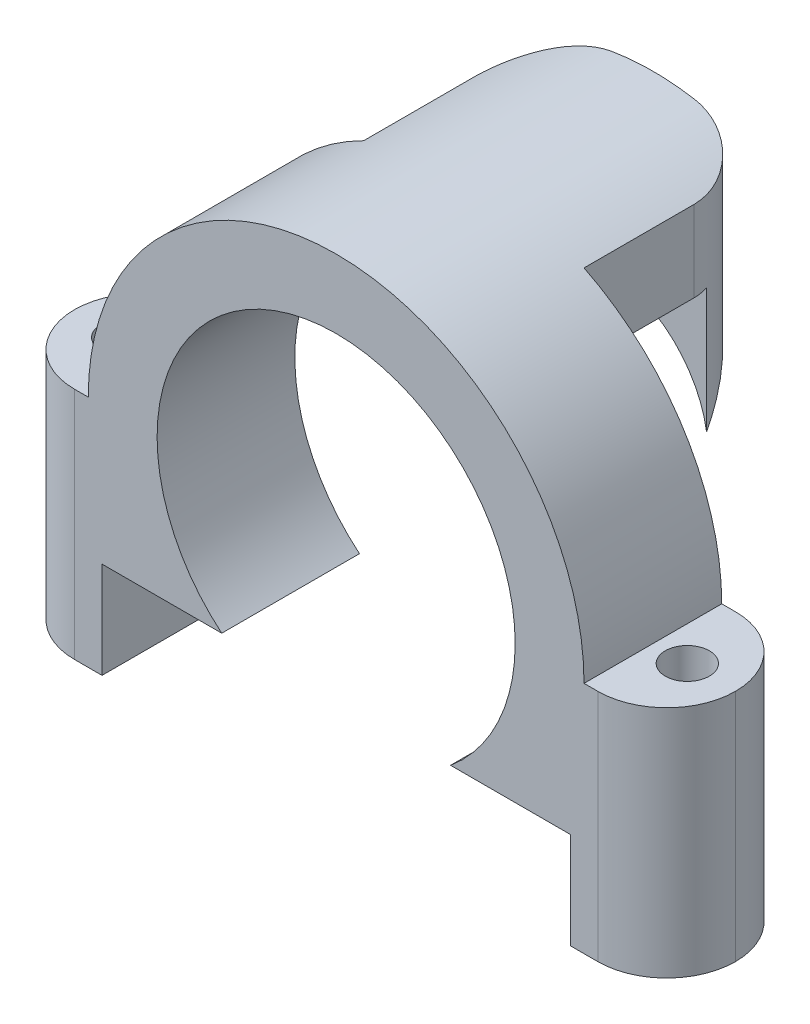
ISO-10303-21;
HEADER;
FILE_DESCRIPTION(('STEP AP214'),'2;1');
FILE_NAME('part.step','',(''),(''),'','','');
FILE_SCHEMA(('AUTOMOTIVE_DESIGN { 1 0 10303 214 1 1 1 1 }'));
ENDSEC;
DATA;
#1=APPLICATION_CONTEXT('core data for automotive mechanical design processes');
#2=APPLICATION_PROTOCOL_DEFINITION('international standard','automotive_design',2000,#1);
#3=PRODUCT_CONTEXT('',#1,'mechanical');
#4=PRODUCT('Part','Part','',(#3));
#5=PRODUCT_RELATED_PRODUCT_CATEGORY('part','',(#4));
#6=PRODUCT_DEFINITION_FORMATION('','',#4);
#7=PRODUCT_DEFINITION_CONTEXT('part definition',#1,'design');
#8=PRODUCT_DEFINITION('design','',#6,#7);
#9=PRODUCT_DEFINITION_SHAPE('','',#8);
#10=(LENGTH_UNIT() NAMED_UNIT(*) SI_UNIT(.MILLI.,.METRE.));
#11=(NAMED_UNIT(*) PLANE_ANGLE_UNIT() SI_UNIT($,.RADIAN.));
#12=(NAMED_UNIT(*) SI_UNIT($,.STERADIAN.) SOLID_ANGLE_UNIT());
#13=UNCERTAINTY_MEASURE_WITH_UNIT(LENGTH_MEASURE(1.E-05),#10,'distance_accuracy_value','');
#14=(GEOMETRIC_REPRESENTATION_CONTEXT(3) GLOBAL_UNCERTAINTY_ASSIGNED_CONTEXT((#13)) GLOBAL_UNIT_ASSIGNED_CONTEXT((#10,
#11,#12)) REPRESENTATION_CONTEXT('',''));
#15=CARTESIAN_POINT('',(0.,0.,0.));
#16=DIRECTION('',(0.,0.,1.));
#17=DIRECTION('',(1.,0.,0.));
#18=AXIS2_PLACEMENT_3D('',#15,#16,#17);
#19=CARTESIAN_POINT('',(0.,6.53295697895827E-07,0.));
#20=DIRECTION('',(0.,0.,1.));
#21=DIRECTION('',(1.,0.,0.));
#22=AXIS2_PLACEMENT_3D('',#19,#20,#21);
#23=PLANE('',#22);
#24=DIRECTION('',(0.,1.,0.));
#25=VECTOR('',#24,1.);
#26=CARTESIAN_POINT('',(-8.,10.2469507659596,0.));
#27=LINE('',#26,#25);
#28=CARTESIAN_POINT('',(-8.,10.2469507659596,0.));
#29=VERTEX_POINT('',#28);
#30=CARTESIAN_POINT('',(-8.,16.1245161498928,0.));
#31=VERTEX_POINT('',#30);
#32=EDGE_CURVE('E192',#29,#31,#27,.T.);
#33=ORIENTED_EDGE('',*,*,#32,.F.);
#34=CARTESIAN_POINT('',(0.,0.,0.));
#35=DIRECTION('',(0.,0.,-1.));
#36=DIRECTION('',(-1.,0.,0.));
#37=AXIS2_PLACEMENT_3D('',#34,#35,#36);
#38=CIRCLE('',#37,13.);
#39=CARTESIAN_POINT('',(-8.30662386291808,-10.,0.));
#40=VERTEX_POINT('',#39);
#41=EDGE_CURVE('E204',#40,#29,#38,.T.);
#42=ORIENTED_EDGE('',*,*,#41,.F.);
#43=DIRECTION('',(1.,0.,0.));
#44=VECTOR('',#43,1.);
#45=CARTESIAN_POINT('',(-24.,-10.,0.));
#46=LINE('',#45,#44);
#47=CARTESIAN_POINT('',(-17.,-10.,0.));
#48=VERTEX_POINT('',#47);
#49=EDGE_CURVE('E241',#48,#40,#46,.T.);
#50=ORIENTED_EDGE('',*,*,#49,.F.);
#51=DIRECTION('',(0.,1.,0.));
#52=VECTOR('',#51,1.);
#53=CARTESIAN_POINT('',(-17.,-17.,0.));
#54=LINE('',#53,#52);
#55=CARTESIAN_POINT('',(-17.,-17.,0.));
#56=VERTEX_POINT('',#55);
#57=EDGE_CURVE('E325',#56,#48,#54,.T.);
#58=ORIENTED_EDGE('',*,*,#57,.F.);
#59=DIRECTION('',(1.,0.,0.));
#60=VECTOR('',#59,1.);
#61=CARTESIAN_POINT('',(0.,-17.,0.));
#62=LINE('',#61,#60);
#63=CARTESIAN_POINT('',(-19.,-17.,0.));
#64=VERTEX_POINT('',#63);
#65=EDGE_CURVE('E323',#64,#56,#62,.T.);
#66=ORIENTED_EDGE('',*,*,#65,.F.);
#67=DIRECTION('',(0.,-1.,0.));
#68=VECTOR('',#67,1.);
#69=CARTESIAN_POINT('',(-19.,6.53295691303878E-07,0.));
#70=LINE('',#69,#68);
#71=CARTESIAN_POINT('',(-19.,0.,0.));
#72=VERTEX_POINT('',#71);
#73=EDGE_CURVE('E267',#64,#72,#70,.F.);
#74=ORIENTED_EDGE('',*,*,#73,.T.);
#75=DIRECTION('',(-1.,0.,0.));
#76=VECTOR('',#75,1.);
#77=CARTESIAN_POINT('',(-18.,0.,0.));
#78=LINE('',#77,#76);
#79=CARTESIAN_POINT('',(-18.,0.,0.));
#80=VERTEX_POINT('',#79);
#81=EDGE_CURVE('E237',#80,#72,#78,.T.);
#82=ORIENTED_EDGE('',*,*,#81,.F.);
#83=CARTESIAN_POINT('',(0.,6.53295697895827E-07,0.));
#84=DIRECTION('',(0.,0.,1.));
#85=DIRECTION('',(1.,0.,0.));
#86=AXIS2_PLACEMENT_3D('',#83,#84,#85);
#87=CIRCLE('',#86,18.);
#88=EDGE_CURVE('E206',#31,#80,#87,.T.);
#89=ORIENTED_EDGE('',*,*,#88,.F.);
#90=EDGE_LOOP('',(#33,#42,#50,#58,#66,#74,#82,#89));
#91=FACE_BOUND('',#90,.T.);
#92=ADVANCED_FACE('F36',(#91),#23,.F.);
#93=DIRECTION('',(0.,-1.,0.));
#94=VECTOR('',#93,1.);
#95=CARTESIAN_POINT('',(8.,10.2469507659596,0.));
#96=LINE('',#95,#94);
#97=CARTESIAN_POINT('',(8.00000000000001,16.1245161498928,0.));
#98=VERTEX_POINT('',#97);
#99=CARTESIAN_POINT('',(8.,10.2469507659596,0.));
#100=VERTEX_POINT('',#99);
#101=EDGE_CURVE('E207',#98,#100,#96,.T.);
#102=ORIENTED_EDGE('',*,*,#101,.F.);
#103=CARTESIAN_POINT('',(18.,0.,0.));
#104=VERTEX_POINT('',#103);
#105=EDGE_CURVE('E216',#104,#98,#87,.T.);
#106=ORIENTED_EDGE('',*,*,#105,.F.);
#107=DIRECTION('',(-1.,0.,0.));
#108=VECTOR('',#107,1.);
#109=CARTESIAN_POINT('',(18.,0.,0.));
#110=LINE('',#109,#108);
#111=CARTESIAN_POINT('',(19.,0.,0.));
#112=VERTEX_POINT('',#111);
#113=EDGE_CURVE('E226',#112,#104,#110,.T.);
#114=ORIENTED_EDGE('',*,*,#113,.F.);
#115=DIRECTION('',(0.,1.,0.));
#116=VECTOR('',#115,1.);
#117=CARTESIAN_POINT('',(19.,6.53295704487776E-07,0.));
#118=LINE('',#117,#116);
#119=CARTESIAN_POINT('',(19.,-17.,0.));
#120=VERTEX_POINT('',#119);
#121=EDGE_CURVE('E269',#112,#120,#118,.F.);
#122=ORIENTED_EDGE('',*,*,#121,.T.);
#123=DIRECTION('',(1.,0.,0.));
#124=VECTOR('',#123,1.);
#125=CARTESIAN_POINT('',(0.,-17.,0.));
#126=LINE('',#125,#124);
#127=CARTESIAN_POINT('',(17.,-17.,0.));
#128=VERTEX_POINT('',#127);
#129=EDGE_CURVE('E337',#128,#120,#126,.T.);
#130=ORIENTED_EDGE('',*,*,#129,.F.);
#131=DIRECTION('',(0.,1.,0.));
#132=VECTOR('',#131,1.);
#133=CARTESIAN_POINT('',(17.,-17.,0.));
#134=LINE('',#133,#132);
#135=CARTESIAN_POINT('',(17.,-10.,0.));
#136=VERTEX_POINT('',#135);
#137=EDGE_CURVE('E348',#128,#136,#134,.T.);
#138=ORIENTED_EDGE('',*,*,#137,.T.);
#139=CARTESIAN_POINT('',(8.30662386291808,-10.,0.));
#140=VERTEX_POINT('',#139);
#141=EDGE_CURVE('E240',#140,#136,#46,.T.);
#142=ORIENTED_EDGE('',*,*,#141,.F.);
#143=EDGE_CURVE('E214',#100,#140,#38,.T.);
#144=ORIENTED_EDGE('',*,*,#143,.F.);
#145=EDGE_LOOP('',(#102,#106,#114,#122,#130,#138,#142,#144));
#146=FACE_BOUND('',#145,.T.);
#147=ADVANCED_FACE('F384',(#146),#23,.F.);
#148=CARTESIAN_POINT('',(-24.,-10.,10.));
#149=DIRECTION('',(0.,1.,0.));
#150=DIRECTION('',(0.,0.,1.));
#151=AXIS2_PLACEMENT_3D('',#148,#149,#150);
#152=PLANE('',#151);
#153=DIRECTION('',(1.,0.,0.));
#154=VECTOR('',#153,1.);
#155=CARTESIAN_POINT('',(-24.,-10.,10.));
#156=LINE('',#155,#154);
#157=CARTESIAN_POINT('',(8.30662386291808,-10.,10.));
#158=VERTEX_POINT('',#157);
#159=CARTESIAN_POINT('',(17.,-10.,10.));
#160=VERTEX_POINT('',#159);
#161=EDGE_CURVE('E229',#158,#160,#156,.T.);
#162=ORIENTED_EDGE('',*,*,#161,.F.);
#163=DIRECTION('',(0.,0.,-1.));
#164=VECTOR('',#163,1.);
#165=CARTESIAN_POINT('',(8.30662386291808,-10.,6.));
#166=LINE('',#165,#164);
#167=EDGE_CURVE('E250',#158,#140,#166,.T.);
#168=ORIENTED_EDGE('',*,*,#167,.T.);
#169=ORIENTED_EDGE('',*,*,#141,.T.);
#170=DIRECTION('',(0.,0.,1.));
#171=VECTOR('',#170,1.);
#172=CARTESIAN_POINT('',(17.,-10.,-33.2782801676287));
#173=LINE('',#172,#171);
#174=EDGE_CURVE('E333',#136,#160,#173,.T.);
#175=ORIENTED_EDGE('',*,*,#174,.T.);
#176=EDGE_LOOP('',(#162,#168,#169,#175));
#177=FACE_BOUND('',#176,.T.);
#178=ADVANCED_FACE('F419',(#177),#152,.F.);
#179=CARTESIAN_POINT('',(0.,6.53295697895827E-07,10.));
#180=DIRECTION('',(0.,0.,1.));
#181=DIRECTION('',(1.,0.,0.));
#182=AXIS2_PLACEMENT_3D('',#179,#180,#181);
#183=PLANE('',#182);
#184=CARTESIAN_POINT('',(0.,0.,10.));
#185=DIRECTION('',(0.,0.,1.));
#186=DIRECTION('',(1.,0.,0.));
#187=AXIS2_PLACEMENT_3D('',#184,#185,#186);
#188=CIRCLE('',#187,13.);
#189=CARTESIAN_POINT('',(-8.30662386291808,-10.,10.));
#190=VERTEX_POINT('',#189);
#191=EDGE_CURVE('E199',#190,#158,#188,.F.);
#192=ORIENTED_EDGE('',*,*,#191,.T.);
#193=ORIENTED_EDGE('',*,*,#161,.T.);
#194=DIRECTION('',(0.,1.,0.));
#195=VECTOR('',#194,1.);
#196=CARTESIAN_POINT('',(17.,-17.,10.));
#197=LINE('',#196,#195);
#198=CARTESIAN_POINT('',(17.,-17.,10.));
#199=VERTEX_POINT('',#198);
#200=EDGE_CURVE('E343',#199,#160,#197,.T.);
#201=ORIENTED_EDGE('',*,*,#200,.F.);
#202=DIRECTION('',(1.,0.,0.));
#203=VECTOR('',#202,1.);
#204=CARTESIAN_POINT('',(0.,-17.,10.));
#205=LINE('',#204,#203);
#206=CARTESIAN_POINT('',(19.,-17.,10.));
#207=VERTEX_POINT('',#206);
#208=EDGE_CURVE('E340',#199,#207,#205,.T.);
#209=ORIENTED_EDGE('',*,*,#208,.T.);
#210=DIRECTION('',(0.,1.,0.));
#211=VECTOR('',#210,1.);
#212=CARTESIAN_POINT('',(19.,0.,10.));
#213=LINE('',#212,#211);
#214=CARTESIAN_POINT('',(19.,0.,10.));
#215=VERTEX_POINT('',#214);
#216=EDGE_CURVE('E256',#207,#215,#213,.T.);
#217=ORIENTED_EDGE('',*,*,#216,.T.);
#218=DIRECTION('',(-1.,0.,0.));
#219=VECTOR('',#218,1.);
#220=CARTESIAN_POINT('',(18.,0.,10.));
#221=LINE('',#220,#219);
#222=CARTESIAN_POINT('',(18.,0.,10.));
#223=VERTEX_POINT('',#222);
#224=EDGE_CURVE('E233',#215,#223,#221,.T.);
#225=ORIENTED_EDGE('',*,*,#224,.T.);
#226=CARTESIAN_POINT('',(0.,6.53295697895827E-07,10.));
#227=DIRECTION('',(0.,0.,1.));
#228=DIRECTION('',(1.,0.,0.));
#229=AXIS2_PLACEMENT_3D('',#226,#227,#228);
#230=CIRCLE('',#229,18.);
#231=CARTESIAN_POINT('',(-18.,0.,10.));
#232=VERTEX_POINT('',#231);
#233=EDGE_CURVE('E222',#223,#232,#230,.T.);
#234=ORIENTED_EDGE('',*,*,#233,.T.);
#235=DIRECTION('',(-1.,0.,0.));
#236=VECTOR('',#235,1.);
#237=CARTESIAN_POINT('',(-18.,0.,10.));
#238=LINE('',#237,#236);
#239=CARTESIAN_POINT('',(-19.,0.,10.));
#240=VERTEX_POINT('',#239);
#241=EDGE_CURVE('E225',#232,#240,#238,.T.);
#242=ORIENTED_EDGE('',*,*,#241,.T.);
#243=DIRECTION('',(0.,-1.,0.));
#244=VECTOR('',#243,1.);
#245=CARTESIAN_POINT('',(-19.,-17.,10.));
#246=LINE('',#245,#244);
#247=CARTESIAN_POINT('',(-19.,-17.,10.));
#248=VERTEX_POINT('',#247);
#249=EDGE_CURVE('E253',#240,#248,#246,.T.);
#250=ORIENTED_EDGE('',*,*,#249,.T.);
#251=DIRECTION('',(1.,0.,0.));
#252=VECTOR('',#251,1.);
#253=CARTESIAN_POINT('',(0.,-17.,10.));
#254=LINE('',#253,#252);
#255=CARTESIAN_POINT('',(-17.,-17.,10.));
#256=VERTEX_POINT('',#255);
#257=EDGE_CURVE('E321',#248,#256,#254,.T.);
#258=ORIENTED_EDGE('',*,*,#257,.T.);
#259=DIRECTION('',(0.,1.,0.));
#260=VECTOR('',#259,1.);
#261=CARTESIAN_POINT('',(-17.,-17.,10.));
#262=LINE('',#261,#260);
#263=CARTESIAN_POINT('',(-17.,-10.,10.));
#264=VERTEX_POINT('',#263);
#265=EDGE_CURVE('E330',#256,#264,#262,.T.);
#266=ORIENTED_EDGE('',*,*,#265,.T.);
#267=EDGE_CURVE('E230',#264,#190,#156,.T.);
#268=ORIENTED_EDGE('',*,*,#267,.T.);
#269=EDGE_LOOP('',(#192,#193,#201,#209,#217,#225,#234,#242,#250,#258,#266,#268));
#270=FACE_BOUND('',#269,.T.);
#271=ADVANCED_FACE('F368',(#270),#183,.T.);
#272=CARTESIAN_POINT('',(0.,6.53295697895827E-07,10.));
#273=DIRECTION('',(0.,0.,-1.));
#274=DIRECTION('',(-1.,0.,0.));
#275=AXIS2_PLACEMENT_3D('',#272,#273,#274);
#276=CYLINDRICAL_SURFACE('',#275,18.);
#277=CARTESIAN_POINT('',(0.,0.,-13.));
#278=DIRECTION('',(0.,0.,-1.));
#279=DIRECTION('',(1.,0.,0.));
#280=AXIS2_PLACEMENT_3D('',#277,#278,#279);
#281=CIRCLE('',#280,18.0000005852265);
#282=CARTESIAN_POINT('',(-3.,17.7482399428268,-13.));
#283=VERTEX_POINT('',#282);
#284=CARTESIAN_POINT('',(3.00000000000001,17.7482399428268,-13.));
#285=VERTEX_POINT('',#284);
#286=EDGE_CURVE('E468',#283,#285,#281,.T.);
#287=ORIENTED_EDGE('',*,*,#286,.F.);
#288=CARTESIAN_POINT('',(-3.,17.7482399428268,-13.));
#289=CARTESIAN_POINT('',(-3.14316237557069,17.724058120837,-13.0000149783251));
#290=CARTESIAN_POINT('',(-3.28600356103933,17.6981153872268,-12.9938519695718));
#291=CARTESIAN_POINT('',(-3.56997368074114,17.6430174261176,-12.9694458275642));
#292=CARTESIAN_POINT('',(-3.71110321544793,17.61386336365,-12.9512070632941));
#293=CARTESIAN_POINT('',(-3.99029951109032,17.55271861298,-12.9029914777806));
#294=CARTESIAN_POINT('',(-4.12837364753594,17.5207359724349,-12.8730471786324));
#295=CARTESIAN_POINT('',(-4.40091298104137,17.4542745495001,-12.8018021304778));
#296=CARTESIAN_POINT('',(-4.53537791733336,17.4197955874108,-12.7605005633103));
#297=CARTESIAN_POINT('',(-4.93178891492285,17.3133468712652,-12.6202345666979));
#298=CARTESIAN_POINT('',(-5.18728326956141,17.2382469787397,-12.5048152721025));
#299=CARTESIAN_POINT('',(-5.67462576103925,17.084034738557,-12.2337109656115));
#300=CARTESIAN_POINT('',(-5.90645594297512,17.0049194113841,-12.0779956916773));
#301=CARTESIAN_POINT('',(-6.34979222974087,16.8445200064896,-11.7232527613008));
#302=CARTESIAN_POINT('',(-6.56014935663975,16.7632720706178,-11.5227697451431));
#303=CARTESIAN_POINT('',(-6.94425247226011,16.6078414630621,-11.0866139740293));
#304=CARTESIAN_POINT('',(-7.1179926098392,16.5336599215755,-10.8509356053632));
#305=CARTESIAN_POINT('',(-7.34606482617979,16.4329613386774,-10.4764794351531));
#306=CARTESIAN_POINT('',(-7.41648107756362,16.4012475158769,-10.3486406680782));
#307=CARTESIAN_POINT('',(-7.54617483109551,16.3419810013723,-10.086536791224));
#308=CARTESIAN_POINT('',(-7.60545777541184,16.3144262779226,-9.95227486169067));
#309=CARTESIAN_POINT('',(-7.71215296047878,16.2642613331573,-9.67844548103771));
#310=CARTESIAN_POINT('',(-7.75958197480813,16.2416441309414,-9.53888585232932));
#311=CARTESIAN_POINT('',(-7.84206635531543,16.2019785732816,-9.25545652932541));
#312=CARTESIAN_POINT('',(-7.87712733576723,16.1849276913571,-9.11158882287285));
#313=CARTESIAN_POINT('',(-7.93698981063472,16.1556628241357,-8.80759803937893));
#314=CARTESIAN_POINT('',(-7.96058509105631,16.1440217307767,-8.64717664839533));
#315=CARTESIAN_POINT('',(-7.98421465259047,16.1323402918031,-8.40519991206023));
#316=CARTESIAN_POINT('',(-7.99013061637205,16.1294098418307,-8.32430893661166));
#317=CARTESIAN_POINT('',(-7.99802371391825,16.125496845392,-8.16228439890615));
#318=CARTESIAN_POINT('',(-8.0000006648757,16.1245143893309,-8.08115082556539));
#319=CARTESIAN_POINT('',(-8.,16.1245161498928,-8.));
#320=B_SPLINE_CURVE_WITH_KNOTS('',3,(#288,#289,#290,#291,#292,#293,#294,#295,#296,#297,#298,
#299,#300,#301,#302,#303,#304,#305,#306,#307,#308,#309,#310,#311,#312,#313,#314,#315,#316,#317,
#318,#319),.UNSPECIFIED.,.F.,.F.,(4,2,2,2,2,2,2,2,2,2,2,2,2,2,2,4),(0.,0.435392965080862,
0.870628491874958,1.30466327880671,1.73872934116996,2.60522270635657,3.47236870091879,
4.37341744770306,5.27461006688168,5.7221734143791,6.16951741184309,6.61622477720137,
7.06272910507154,7.54938826982394,7.7927653307537,8.03615368640039),.UNSPECIFIED.);
#321=CARTESIAN_POINT('',(-8.,16.1245161498928,-8.));
#322=VERTEX_POINT('',#321);
#323=EDGE_CURVE('E293',#283,#322,#320,.T.);
#324=ORIENTED_EDGE('',*,*,#323,.T.);
#325=DIRECTION('',(0.,0.,1.));
#326=VECTOR('',#325,1.);
#327=CARTESIAN_POINT('',(-8.,16.1245161498928,-9.));
#328=LINE('',#327,#326);
#329=EDGE_CURVE('E200',#322,#31,#328,.T.);
#330=ORIENTED_EDGE('',*,*,#329,.T.);
#331=ORIENTED_EDGE('',*,*,#88,.T.);
#332=DIRECTION('',(0.,0.,-1.));
#333=VECTOR('',#332,1.);
#334=CARTESIAN_POINT('',(-18.,0.,10.));
#335=LINE('',#334,#333);
#336=EDGE_CURVE('E246',#232,#80,#335,.T.);
#337=ORIENTED_EDGE('',*,*,#336,.F.);
#338=ORIENTED_EDGE('',*,*,#233,.F.);
#339=DIRECTION('',(0.,0.,-1.));
#340=VECTOR('',#339,1.);
#341=CARTESIAN_POINT('',(18.,0.,10.));
#342=LINE('',#341,#340);
#343=EDGE_CURVE('E234',#223,#104,#342,.T.);
#344=ORIENTED_EDGE('',*,*,#343,.T.);
#345=ORIENTED_EDGE('',*,*,#105,.T.);
#346=DIRECTION('',(0.,0.,1.));
#347=VECTOR('',#346,1.);
#348=CARTESIAN_POINT('',(8.00000000000001,16.1245161498928,-9.));
#349=LINE('',#348,#347);
#350=CARTESIAN_POINT('',(8.00000000000001,16.1245161498928,-8.));
#351=VERTEX_POINT('',#350);
#352=EDGE_CURVE('E313',#351,#98,#349,.T.);
#353=ORIENTED_EDGE('',*,*,#352,.F.);
#354=CARTESIAN_POINT('',(8.00000000000001,16.1245161498928,-8.));
#355=CARTESIAN_POINT('',(8.0000222337078,16.1244919780298,-8.13202101531183));
#356=CARTESIAN_POINT('',(7.99477214977667,16.1271095463448,-8.26403022610739));
#357=CARTESIAN_POINT('',(7.97389442193796,16.1374495282992,-8.52697346061946));
#358=CARTESIAN_POINT('',(7.95827088365557,16.1451699223272,-8.65790788896834));
#359=CARTESIAN_POINT('',(7.91690339031869,16.1654928146154,-8.91718996165917));
#360=CARTESIAN_POINT('',(7.8912038234646,16.1780738964567,-9.04554639060287));
#361=CARTESIAN_POINT('',(7.82998088711945,16.2077939465973,-9.29935612822058));
#362=CARTESIAN_POINT('',(7.79445690933398,16.2249331971205,-9.42480925661061));
#363=CARTESIAN_POINT('',(7.7140087853257,16.2633350964308,-9.67181474021454));
#364=CARTESIAN_POINT('',(7.66909802585852,16.2845918699737,-9.79337236920734));
#365=CARTESIAN_POINT('',(7.57027403770922,16.3307668485678,-10.0320692899112));
#366=CARTESIAN_POINT('',(7.51635741596478,16.3556864331989,-10.1492068958592));
#367=CARTESIAN_POINT('',(7.34170226254043,16.4352002829623,-10.4931226610116));
#368=CARTESIAN_POINT('',(7.20805665790651,16.4945505215019,-10.7124091915609));
#369=CARTESIAN_POINT('',(6.90179698867781,16.6251142536656,-11.1382744838696));
#370=CARTESIAN_POINT('',(6.72738560316027,16.6968133374398,-11.3433999412831));
#371=CARTESIAN_POINT('',(6.34886292971728,16.8443824066329,-11.722483351293));
#372=CARTESIAN_POINT('',(6.14473892137532,16.9202541697384,-11.8964278833378));
#373=CARTESIAN_POINT('',(5.69396159506863,17.0774748407382,-12.2220710547069));
#374=CARTESIAN_POINT('',(5.44521858286892,17.1587804809164,-12.3709080507776));
#375=CARTESIAN_POINT('',(4.92439676816108,17.3154297028822,-12.6238938822678));
#376=CARTESIAN_POINT('',(4.65233619631925,17.3907778554535,-12.7280772541715));
#377=CARTESIAN_POINT('',(4.15092246886841,17.5163331060582,-12.8711682095608));
#378=CARTESIAN_POINT('',(3.9246490550475,17.5684923627257,-12.9192042946261));
#379=CARTESIAN_POINT('',(3.58067878885885,17.6406505282204,-12.9675200495833));
#380=CARTESIAN_POINT('',(3.46519821265621,17.663700633,-12.9796690434036));
#381=CARTESIAN_POINT('',(3.23322338580852,17.7076329656372,-12.9959115047899));
#382=CARTESIAN_POINT('',(3.11672881034459,17.7285144688707,-13.0000022879087));
#383=CARTESIAN_POINT('',(3.00000001435777,17.7482400001676,-13.));
#384=B_SPLINE_CURVE_WITH_KNOTS('',3,(#354,#355,#356,#357,#358,#359,#360,#361,#362,#363,#364,
#365,#366,#367,#368,#369,#370,#371,#372,#373,#374,#375,#376,#377,#378,#379,#380,#381,#382,#383),
.UNSPECIFIED.,.F.,.F.,(4,2,2,2,2,2,2,2,2,2,2,2,2,2,4),(0.,0.395914229182373,0.791671856020214,
1.18570528433774,1.57976311534142,1.97326275765572,2.3669109912883,3.15419032648427,
3.98668820936115,4.81954355097226,5.7185060673813,6.61677203838417,7.3257708214226,
7.68065492093143,8.0356572236762),.UNSPECIFIED.);
#385=EDGE_CURVE('E454',#351,#285,#384,.T.);
#386=ORIENTED_EDGE('',*,*,#385,.T.);
#387=EDGE_LOOP('',(#287,#324,#330,#331,#337,#338,#344,#345,#353,#386));
#388=FACE_BOUND('',#387,.T.);
#389=ADVANCED_FACE('F390',(#388),#276,.T.);
#390=CARTESIAN_POINT('',(-18.,0.,10.));
#391=DIRECTION('',(0.,-1.,0.));
#392=DIRECTION('',(1.,0.,0.));
#393=AXIS2_PLACEMENT_3D('',#390,#391,#392);
#394=PLANE('',#393);
#395=CARTESIAN_POINT('',(-20.5,0.,5.));
#396=DIRECTION('',(0.,1.,0.));
#397=DIRECTION('',(0.,0.,1.));
#398=AXIS2_PLACEMENT_3D('',#395,#396,#397);
#399=CIRCLE('',#398,1.6);
#400=CARTESIAN_POINT('',(-20.5,0.,6.6));
#401=VERTEX_POINT('',#400);
#402=EDGE_CURVE('E349',#401,#401,#399,.T.);
#403=ORIENTED_EDGE('',*,*,#402,.F.);
#404=EDGE_LOOP('',(#403));
#405=FACE_BOUND('',#404,.T.);
#406=CARTESIAN_POINT('',(-19.,0.,5.));
#407=DIRECTION('',(0.,-1.,0.));
#408=DIRECTION('',(1.,0.,0.));
#409=AXIS2_PLACEMENT_3D('',#406,#407,#408);
#410=CIRCLE('',#409,5.);
#411=CARTESIAN_POINT('',(-24.,0.,5.));
#412=VERTEX_POINT('',#411);
#413=EDGE_CURVE('E275',#72,#412,#410,.F.);
#414=ORIENTED_EDGE('',*,*,#413,.T.);
#415=CARTESIAN_POINT('',(-19.,0.,5.));
#416=DIRECTION('',(0.,-1.,0.));
#417=DIRECTION('',(1.,0.,0.));
#418=AXIS2_PLACEMENT_3D('',#415,#416,#417);
#419=CIRCLE('',#418,5.);
#420=EDGE_CURVE('E277',#412,#240,#419,.F.);
#421=ORIENTED_EDGE('',*,*,#420,.T.);
#422=ORIENTED_EDGE('',*,*,#241,.F.);
#423=ORIENTED_EDGE('',*,*,#336,.T.);
#424=ORIENTED_EDGE('',*,*,#81,.T.);
#425=EDGE_LOOP('',(#414,#421,#422,#423,#424));
#426=FACE_BOUND('',#425,.T.);
#427=ADVANCED_FACE('F393',(#405,#426),#394,.F.);
#428=DIRECTION('',(0.,0.,-1.));
#429=VECTOR('',#428,1.);
#430=CARTESIAN_POINT('',(-8.30662386291808,-10.,6.));
#431=LINE('',#430,#429);
#432=EDGE_CURVE('E213',#40,#190,#431,.F.);
#433=ORIENTED_EDGE('',*,*,#432,.T.);
#434=ORIENTED_EDGE('',*,*,#267,.F.);
#435=DIRECTION('',(0.,0.,-1.));
#436=VECTOR('',#435,1.);
#437=CARTESIAN_POINT('',(-17.,-10.,-33.2782801676287));
#438=LINE('',#437,#436);
#439=EDGE_CURVE('E283',#264,#48,#438,.T.);
#440=ORIENTED_EDGE('',*,*,#439,.T.);
#441=ORIENTED_EDGE('',*,*,#49,.T.);
#442=EDGE_LOOP('',(#433,#434,#440,#441));
#443=FACE_BOUND('',#442,.T.);
#444=ADVANCED_FACE('F361',(#443),#152,.F.);
#445=CARTESIAN_POINT('',(18.,0.,10.));
#446=DIRECTION('',(0.,-1.,0.));
#447=DIRECTION('',(0.,0.,-1.));
#448=AXIS2_PLACEMENT_3D('',#445,#446,#447);
#449=PLANE('',#448);
#450=CARTESIAN_POINT('',(20.5,0.,5.));
#451=DIRECTION('',(0.,1.,0.));
#452=DIRECTION('',(0.,0.,1.));
#453=AXIS2_PLACEMENT_3D('',#450,#451,#452);
#454=CIRCLE('',#453,1.6);
#455=CARTESIAN_POINT('',(20.5,0.,6.6));
#456=VERTEX_POINT('',#455);
#457=EDGE_CURVE('E218',#456,#456,#454,.T.);
#458=ORIENTED_EDGE('',*,*,#457,.F.);
#459=EDGE_LOOP('',(#458));
#460=FACE_BOUND('',#459,.T.);
#461=ORIENTED_EDGE('',*,*,#224,.F.);
#462=CARTESIAN_POINT('',(19.,0.,5.));
#463=DIRECTION('',(0.,-1.,0.));
#464=DIRECTION('',(0.,0.,-1.));
#465=AXIS2_PLACEMENT_3D('',#462,#463,#464);
#466=CIRCLE('',#465,5.);
#467=CARTESIAN_POINT('',(24.,0.,5.));
#468=VERTEX_POINT('',#467);
#469=EDGE_CURVE('E261',#215,#468,#466,.F.);
#470=ORIENTED_EDGE('',*,*,#469,.T.);
#471=CARTESIAN_POINT('',(19.,0.,5.));
#472=DIRECTION('',(0.,-1.,0.));
#473=DIRECTION('',(0.,0.,-1.));
#474=AXIS2_PLACEMENT_3D('',#471,#472,#473);
#475=CIRCLE('',#474,5.);
#476=EDGE_CURVE('E259',#468,#112,#475,.F.);
#477=ORIENTED_EDGE('',*,*,#476,.T.);
#478=ORIENTED_EDGE('',*,*,#113,.T.);
#479=ORIENTED_EDGE('',*,*,#343,.F.);
#480=EDGE_LOOP('',(#461,#470,#477,#478,#479));
#481=FACE_BOUND('',#480,.T.);
#482=ADVANCED_FACE('F358',(#460,#481),#449,.F.);
#483=CARTESIAN_POINT('',(0.,0.,6.));
#484=DIRECTION('',(0.,0.,-1.));
#485=DIRECTION('',(-1.,0.,0.));
#486=AXIS2_PLACEMENT_3D('',#483,#484,#485);
#487=CYLINDRICAL_SURFACE('',#486,13.);
#488=DIRECTION('',(0.,0.,1.));
#489=VECTOR('',#488,1.);
#490=CARTESIAN_POINT('',(-8.,10.2469507659596,-9.));
#491=LINE('',#490,#489);
#492=CARTESIAN_POINT('',(-8.,10.2469507659596,-8.));
#493=VERTEX_POINT('',#492);
#494=EDGE_CURVE('E188',#493,#29,#491,.T.);
#495=ORIENTED_EDGE('',*,*,#494,.F.);
#496=CARTESIAN_POINT('',(-8.,10.2469507659596,-8.));
#497=CARTESIAN_POINT('',(-8.00000615855153,10.2469417226686,-8.08440299544958));
#498=CARTESIAN_POINT('',(-7.99786291707773,10.2486192354111,-8.16880281481918));
#499=CARTESIAN_POINT('',(-7.98934095005651,10.2552660647361,-8.33692354602076));
#500=CARTESIAN_POINT('',(-7.98297901256,10.2602223335179,-8.42064582275639));
#501=CARTESIAN_POINT('',(-7.96608246310548,10.2733462323427,-8.58740960895958));
#502=CARTESIAN_POINT('',(-7.95554797161204,10.281513769674,-8.67045113801016));
#503=CARTESIAN_POINT('',(-7.93034932625937,10.3009609832765,-8.83588044049619));
#504=CARTESIAN_POINT('',(-7.9156689371632,10.3122528909149,-8.91826430759948));
#505=CARTESIAN_POINT('',(-7.89897948556635,10.3250241203884,-9.));
#506=B_SPLINE_CURVE_WITH_KNOTS('',3,(#496,#497,#498,#499,#500,#501,#502,#503,#504,#505),
.UNSPECIFIED.,.F.,.F.,(4,2,2,2,4),(0.,0.253160212101457,0.505318985846606,0.757470480121291,
1.01062342156523),.UNSPECIFIED.);
#507=CARTESIAN_POINT('',(-7.89897948556635,10.3250241203884,-9.));
#508=VERTEX_POINT('',#507);
#509=EDGE_CURVE('E526',#493,#508,#506,.T.);
#510=ORIENTED_EDGE('',*,*,#509,.T.);
#511=CARTESIAN_POINT('',(0.,0.,-9.));
#512=DIRECTION('',(0.,0.,1.));
#513=DIRECTION('',(-1.,0.,0.));
#514=AXIS2_PLACEMENT_3D('',#511,#512,#513);
#515=CIRCLE('',#514,13.);
#516=CARTESIAN_POINT('',(7.89897948556636,10.3250241203884,-9.));
#517=VERTEX_POINT('',#516);
#518=EDGE_CURVE('E301',#517,#508,#515,.T.);
#519=ORIENTED_EDGE('',*,*,#518,.F.);
#520=CARTESIAN_POINT('',(7.89897948556636,10.3250241203884,-9.));
#521=CARTESIAN_POINT('',(7.91566893716321,10.3122528909149,-8.91826430759948));
#522=CARTESIAN_POINT('',(7.93034932625938,10.3009609832765,-8.83588044049619));
#523=CARTESIAN_POINT('',(7.95554797161204,10.281513769674,-8.67045113801016));
#524=CARTESIAN_POINT('',(7.96608246310548,10.2733462323427,-8.58740960895958));
#525=CARTESIAN_POINT('',(7.98297901256,10.2602223335179,-8.42064582275639));
#526=CARTESIAN_POINT('',(7.98934095005652,10.2552660647361,-8.33692354602076));
#527=CARTESIAN_POINT('',(7.99786291707774,10.2486192354111,-8.16880281481918));
#528=CARTESIAN_POINT('',(8.00000615855154,10.2469417226686,-8.08440299544958));
#529=CARTESIAN_POINT('',(8.,10.2469507659596,-8.));
#530=B_SPLINE_CURVE_WITH_KNOTS('',3,(#520,#521,#522,#523,#524,#525,#526,#527,#528,#529),
.UNSPECIFIED.,.F.,.F.,(4,2,2,2,4),(0.,0.253152941443936,0.50530443571862,0.75746320946377,
1.01062342156523),.UNSPECIFIED.);
#531=CARTESIAN_POINT('',(8.,10.2469507659596,-8.));
#532=VERTEX_POINT('',#531);
#533=EDGE_CURVE('E300',#517,#532,#530,.T.);
#534=ORIENTED_EDGE('',*,*,#533,.T.);
#535=DIRECTION('',(0.,0.,1.));
#536=VECTOR('',#535,1.);
#537=CARTESIAN_POINT('',(8.,10.2469507659596,-9.));
#538=LINE('',#537,#536);
#539=EDGE_CURVE('E304',#532,#100,#538,.T.);
#540=ORIENTED_EDGE('',*,*,#539,.T.);
#541=ORIENTED_EDGE('',*,*,#143,.T.);
#542=ORIENTED_EDGE('',*,*,#167,.F.);
#543=ORIENTED_EDGE('',*,*,#191,.F.);
#544=ORIENTED_EDGE('',*,*,#432,.F.);
#545=ORIENTED_EDGE('',*,*,#41,.T.);
#546=EDGE_LOOP('',(#495,#510,#519,#534,#540,#541,#542,#543,#544,#545));
#547=FACE_BOUND('',#546,.T.);
#548=ADVANCED_FACE('F211',(#547),#487,.F.);
#549=CARTESIAN_POINT('',(20.5,-14.5254833995939,5.));
#550=DIRECTION('',(0.,1.,0.));
#551=DIRECTION('',(0.,0.,1.));
#552=AXIS2_PLACEMENT_3D('',#549,#550,#551);
#553=CYLINDRICAL_SURFACE('',#552,1.6);
#554=CARTESIAN_POINT('',(20.5,-6.86995696904863,5.));
#555=DIRECTION('',(0.,-1.,0.));
#556=DIRECTION('',(0.,0.,-1.));
#557=AXIS2_PLACEMENT_3D('',#554,#555,#556);
#558=CIRCLE('',#557,1.6);
#559=CARTESIAN_POINT('',(20.5,-6.86995696904863,3.4));
#560=VERTEX_POINT('',#559);
#561=EDGE_CURVE('E477',#560,#560,#558,.T.);
#562=ORIENTED_EDGE('',*,*,#561,.T.);
#563=EDGE_LOOP('',(#562));
#564=FACE_BOUND('',#563,.T.);
#565=ORIENTED_EDGE('',*,*,#457,.T.);
#566=EDGE_LOOP('',(#565));
#567=FACE_BOUND('',#566,.T.);
#568=ADVANCED_FACE('F356',(#564,#567),#553,.F.);
#569=CARTESIAN_POINT('',(-20.5,-14.5254833995939,5.));
#570=DIRECTION('',(0.,1.,0.));
#571=DIRECTION('',(0.,0.,1.));
#572=AXIS2_PLACEMENT_3D('',#569,#570,#571);
#573=CYLINDRICAL_SURFACE('',#572,1.6);
#574=CARTESIAN_POINT('',(-20.5,-6.86995696904863,5.));
#575=DIRECTION('',(0.,-1.,0.));
#576=DIRECTION('',(0.,0.,-1.));
#577=AXIS2_PLACEMENT_3D('',#574,#575,#576);
#578=CIRCLE('',#577,1.6);
#579=CARTESIAN_POINT('',(-20.5,-6.86995696904863,3.4));
#580=VERTEX_POINT('',#579);
#581=EDGE_CURVE('E41',#580,#580,#578,.T.);
#582=ORIENTED_EDGE('',*,*,#581,.T.);
#583=EDGE_LOOP('',(#582));
#584=FACE_BOUND('',#583,.T.);
#585=ORIENTED_EDGE('',*,*,#402,.T.);
#586=EDGE_LOOP('',(#585));
#587=FACE_BOUND('',#586,.T.);
#588=ADVANCED_FACE('F434',(#584,#587),#573,.F.);
#589=CARTESIAN_POINT('',(17.,-17.,-33.2782801676287));
#590=DIRECTION('',(-1.,0.,0.));
#591=DIRECTION('',(0.,0.,1.));
#592=AXIS2_PLACEMENT_3D('',#589,#590,#591);
#593=PLANE('',#592);
#594=ORIENTED_EDGE('',*,*,#174,.F.);
#595=ORIENTED_EDGE('',*,*,#137,.F.);
#596=DIRECTION('',(0.,0.,1.));
#597=VECTOR('',#596,1.);
#598=CARTESIAN_POINT('',(17.,-17.,-33.2782801676287));
#599=LINE('',#598,#597);
#600=EDGE_CURVE('E334',#128,#199,#599,.T.);
#601=ORIENTED_EDGE('',*,*,#600,.T.);
#602=ORIENTED_EDGE('',*,*,#200,.T.);
#603=EDGE_LOOP('',(#594,#595,#601,#602));
#604=FACE_BOUND('',#603,.T.);
#605=ADVANCED_FACE('F423',(#604),#593,.T.);
#606=CARTESIAN_POINT('',(0.,-17.,-33.2782801676287));
#607=DIRECTION('',(0.,-1.,0.));
#608=DIRECTION('',(0.,0.,-1.));
#609=AXIS2_PLACEMENT_3D('',#606,#607,#608);
#610=PLANE('',#609);
#611=CARTESIAN_POINT('',(20.5,-17.,5.));
#612=DIRECTION('',(0.,-1.,0.));
#613=DIRECTION('',(0.,0.,-1.));
#614=AXIS2_PLACEMENT_3D('',#611,#612,#613);
#615=CIRCLE('',#614,1.64999999999999);
#616=CARTESIAN_POINT('',(20.5,-17.,3.35000000000001));
#617=VERTEX_POINT('',#616);
#618=EDGE_CURVE('E478',#617,#617,#615,.T.);
#619=ORIENTED_EDGE('',*,*,#618,.F.);
#620=EDGE_LOOP('',(#619));
#621=FACE_BOUND('',#620,.T.);
#622=CARTESIAN_POINT('',(19.,-17.,5.));
#623=DIRECTION('',(0.,-1.,0.));
#624=DIRECTION('',(0.,0.,-1.));
#625=AXIS2_PLACEMENT_3D('',#622,#623,#624);
#626=CIRCLE('',#625,5.);
#627=CARTESIAN_POINT('',(24.,-17.,5.));
#628=VERTEX_POINT('',#627);
#629=EDGE_CURVE('E263',#120,#628,#626,.T.);
#630=ORIENTED_EDGE('',*,*,#629,.T.);
#631=CARTESIAN_POINT('',(19.,-17.,5.));
#632=DIRECTION('',(0.,-1.,0.));
#633=DIRECTION('',(0.,0.,-1.));
#634=AXIS2_PLACEMENT_3D('',#631,#632,#633);
#635=CIRCLE('',#634,5.);
#636=EDGE_CURVE('E265',#628,#207,#635,.T.);
#637=ORIENTED_EDGE('',*,*,#636,.T.);
#638=ORIENTED_EDGE('',*,*,#208,.F.);
#639=ORIENTED_EDGE('',*,*,#600,.F.);
#640=ORIENTED_EDGE('',*,*,#129,.T.);
#641=EDGE_LOOP('',(#630,#637,#638,#639,#640));
#642=FACE_BOUND('',#641,.T.);
#643=ADVANCED_FACE('F425',(#621,#642),#610,.T.);
#644=CARTESIAN_POINT('',(-17.,-17.,-33.2782801676287));
#645=DIRECTION('',(1.,0.,0.));
#646=DIRECTION('',(0.,0.,-1.));
#647=AXIS2_PLACEMENT_3D('',#644,#645,#646);
#648=PLANE('',#647);
#649=ORIENTED_EDGE('',*,*,#439,.F.);
#650=ORIENTED_EDGE('',*,*,#265,.F.);
#651=DIRECTION('',(0.,0.,-1.));
#652=VECTOR('',#651,1.);
#653=CARTESIAN_POINT('',(-17.,-17.,-33.2782801676287));
#654=LINE('',#653,#652);
#655=EDGE_CURVE('E318',#256,#56,#654,.T.);
#656=ORIENTED_EDGE('',*,*,#655,.T.);
#657=ORIENTED_EDGE('',*,*,#57,.T.);
#658=EDGE_LOOP('',(#649,#650,#656,#657));
#659=FACE_BOUND('',#658,.T.);
#660=ADVANCED_FACE('F413',(#659),#648,.T.);
#661=CARTESIAN_POINT('',(0.,-17.,-33.2782801676287));
#662=DIRECTION('',(0.,-1.,0.));
#663=DIRECTION('',(0.,0.,-1.));
#664=AXIS2_PLACEMENT_3D('',#661,#662,#663);
#665=PLANE('',#664);
#666=CARTESIAN_POINT('',(-20.5,-17.,5.));
#667=DIRECTION('',(0.,-1.,0.));
#668=DIRECTION('',(0.,0.,-1.));
#669=AXIS2_PLACEMENT_3D('',#666,#667,#668);
#670=CIRCLE('',#669,1.64999999999999);
#671=CARTESIAN_POINT('',(-20.5,-17.,3.35000000000001));
#672=VERTEX_POINT('',#671);
#673=EDGE_CURVE('E484',#672,#672,#670,.T.);
#674=ORIENTED_EDGE('',*,*,#673,.F.);
#675=EDGE_LOOP('',(#674));
#676=FACE_BOUND('',#675,.T.);
#677=ORIENTED_EDGE('',*,*,#257,.F.);
#678=CARTESIAN_POINT('',(-19.,-17.,5.));
#679=DIRECTION('',(0.,-1.,0.));
#680=DIRECTION('',(0.,0.,-1.));
#681=AXIS2_PLACEMENT_3D('',#678,#679,#680);
#682=CIRCLE('',#681,5.);
#683=CARTESIAN_POINT('',(-24.,-17.,5.));
#684=VERTEX_POINT('',#683);
#685=EDGE_CURVE('E273',#248,#684,#682,.T.);
#686=ORIENTED_EDGE('',*,*,#685,.T.);
#687=CARTESIAN_POINT('',(-19.,-17.,5.));
#688=DIRECTION('',(0.,-1.,0.));
#689=DIRECTION('',(0.,0.,-1.));
#690=AXIS2_PLACEMENT_3D('',#687,#688,#689);
#691=CIRCLE('',#690,5.);
#692=EDGE_CURVE('E271',#684,#64,#691,.T.);
#693=ORIENTED_EDGE('',*,*,#692,.T.);
#694=ORIENTED_EDGE('',*,*,#65,.T.);
#695=ORIENTED_EDGE('',*,*,#655,.F.);
#696=EDGE_LOOP('',(#677,#686,#693,#694,#695));
#697=FACE_BOUND('',#696,.T.);
#698=ADVANCED_FACE('F403',(#676,#697),#665,.T.);
#699=CARTESIAN_POINT('',(19.,0.,5.));
#700=DIRECTION('',(0.,1.,0.));
#701=DIRECTION('',(-1.,0.,0.));
#702=AXIS2_PLACEMENT_3D('',#699,#700,#701);
#703=CYLINDRICAL_SURFACE('',#702,5.);
#704=DIRECTION('',(0.,1.,0.));
#705=VECTOR('',#704,1.);
#706=CARTESIAN_POINT('',(24.,0.,5.));
#707=LINE('',#706,#705);
#708=EDGE_CURVE('E280',#628,#468,#707,.T.);
#709=ORIENTED_EDGE('',*,*,#708,.F.);
#710=ORIENTED_EDGE('',*,*,#629,.F.);
#711=ORIENTED_EDGE('',*,*,#121,.F.);
#712=ORIENTED_EDGE('',*,*,#476,.F.);
#713=EDGE_LOOP('',(#709,#710,#711,#712));
#714=FACE_BOUND('',#713,.T.);
#715=ADVANCED_FACE('F378',(#714),#703,.T.);
#716=CARTESIAN_POINT('',(19.,6.53295704487776E-07,5.));
#717=DIRECTION('',(0.,-1.,0.));
#718=DIRECTION('',(1.,0.,0.));
#719=AXIS2_PLACEMENT_3D('',#716,#717,#718);
#720=CYLINDRICAL_SURFACE('',#719,5.);
#721=ORIENTED_EDGE('',*,*,#636,.F.);
#722=ORIENTED_EDGE('',*,*,#708,.T.);
#723=ORIENTED_EDGE('',*,*,#469,.F.);
#724=ORIENTED_EDGE('',*,*,#216,.F.);
#725=EDGE_LOOP('',(#721,#722,#723,#724));
#726=FACE_BOUND('',#725,.T.);
#727=ADVANCED_FACE('F374',(#726),#720,.T.);
#728=CARTESIAN_POINT('',(-19.,0.,5.));
#729=DIRECTION('',(0.,-1.,0.));
#730=DIRECTION('',(1.,0.,0.));
#731=AXIS2_PLACEMENT_3D('',#728,#729,#730);
#732=CYLINDRICAL_SURFACE('',#731,5.);
#733=DIRECTION('',(0.,-1.,0.));
#734=VECTOR('',#733,1.);
#735=CARTESIAN_POINT('',(-24.,0.,5.));
#736=LINE('',#735,#734);
#737=EDGE_CURVE('E284',#412,#684,#736,.T.);
#738=ORIENTED_EDGE('',*,*,#737,.F.);
#739=ORIENTED_EDGE('',*,*,#413,.F.);
#740=ORIENTED_EDGE('',*,*,#73,.F.);
#741=ORIENTED_EDGE('',*,*,#692,.F.);
#742=EDGE_LOOP('',(#738,#739,#740,#741));
#743=FACE_BOUND('',#742,.T.);
#744=ADVANCED_FACE('F408',(#743),#732,.T.);
#745=CARTESIAN_POINT('',(-19.,6.53295691303878E-07,5.));
#746=DIRECTION('',(0.,1.,0.));
#747=DIRECTION('',(-1.,0.,0.));
#748=AXIS2_PLACEMENT_3D('',#745,#746,#747);
#749=CYLINDRICAL_SURFACE('',#748,5.);
#750=ORIENTED_EDGE('',*,*,#420,.F.);
#751=ORIENTED_EDGE('',*,*,#737,.T.);
#752=ORIENTED_EDGE('',*,*,#685,.F.);
#753=ORIENTED_EDGE('',*,*,#249,.F.);
#754=EDGE_LOOP('',(#750,#751,#752,#753));
#755=FACE_BOUND('',#754,.T.);
#756=ADVANCED_FACE('F399',(#755),#749,.T.);
#757=CARTESIAN_POINT('',(-8.,10.2469507659596,-9.));
#758=DIRECTION('',(1.,0.,0.));
#759=DIRECTION('',(0.,0.,-1.));
#760=AXIS2_PLACEMENT_3D('',#757,#758,#759);
#761=PLANE('',#760);
#762=ORIENTED_EDGE('',*,*,#329,.F.);
#763=DIRECTION('',(0.,1.,0.));
#764=VECTOR('',#763,1.);
#765=CARTESIAN_POINT('',(-8.,10.2469507659596,-8.));
#766=LINE('',#765,#764);
#767=EDGE_CURVE('E195',#322,#493,#766,.F.);
#768=ORIENTED_EDGE('',*,*,#767,.T.);
#769=ORIENTED_EDGE('',*,*,#494,.T.);
#770=ORIENTED_EDGE('',*,*,#32,.T.);
#771=EDGE_LOOP('',(#762,#768,#769,#770));
#772=FACE_BOUND('',#771,.T.);
#773=ADVANCED_FACE('F191',(#772),#761,.F.);
#774=CARTESIAN_POINT('',(8.,10.2469507659596,-9.));
#775=DIRECTION('',(-1.,0.,0.));
#776=DIRECTION('',(0.,-1.,0.));
#777=AXIS2_PLACEMENT_3D('',#774,#775,#776);
#778=PLANE('',#777);
#779=ORIENTED_EDGE('',*,*,#539,.F.);
#780=DIRECTION('',(0.,-1.,0.));
#781=VECTOR('',#780,1.);
#782=CARTESIAN_POINT('',(8.,10.2469507659596,-8.));
#783=LINE('',#782,#781);
#784=EDGE_CURVE('E11',#532,#351,#783,.F.);
#785=ORIENTED_EDGE('',*,*,#784,.T.);
#786=ORIENTED_EDGE('',*,*,#352,.T.);
#787=ORIENTED_EDGE('',*,*,#101,.T.);
#788=EDGE_LOOP('',(#779,#785,#786,#787));
#789=FACE_BOUND('',#788,.T.);
#790=ADVANCED_FACE('F498',(#789),#778,.F.);
#791=CARTESIAN_POINT('',(0.,0.,-13.));
#792=DIRECTION('',(0.,0.,1.));
#793=DIRECTION('',(1.,0.,0.));
#794=AXIS2_PLACEMENT_3D('',#791,#792,#793);
#795=CYLINDRICAL_SURFACE('',#794,8.);
#796=CARTESIAN_POINT('',(0.,0.,-9.));
#797=DIRECTION('',(0.,0.,1.));
#798=DIRECTION('',(-1.,0.,0.));
#799=AXIS2_PLACEMENT_3D('',#796,#797,#798);
#800=CIRCLE('',#799,8.);
#801=CARTESIAN_POINT('',(7.89897948556635,1.26732911534535,-9.));
#802=VERTEX_POINT('',#801);
#803=CARTESIAN_POINT('',(-7.89897948556635,1.26732911534533,-9.));
#804=VERTEX_POINT('',#803);
#805=EDGE_CURVE('E308',#802,#804,#800,.T.);
#806=ORIENTED_EDGE('',*,*,#805,.T.);
#807=CARTESIAN_POINT('',(-7.89897948556635,1.26732911534533,-9.));
#808=CARTESIAN_POINT('',(-7.8780601164266,1.39768900927026,-9.10246224222595));
#809=CARTESIAN_POINT('',(-7.85387831580086,1.52780392520423,-9.2045460977578));
#810=CARTESIAN_POINT('',(-7.79889366712285,1.78742295306539,-9.40773127036092));
#811=CARTESIAN_POINT('',(-7.76809008980231,1.91692699610936,-9.50883247792852));
#812=CARTESIAN_POINT('',(-7.66546581739791,2.30484484706736,-9.81071481899625));
#813=CARTESIAN_POINT('',(-7.58351925922988,2.56211155282123,-10.0096390413255));
#814=CARTESIAN_POINT('',(-7.39059462630483,3.07490213683725,-10.4023091035908));
#815=CARTESIAN_POINT('',(-7.27928813402055,3.33037041638422,-10.5959671378838));
#816=CARTESIAN_POINT('',(-7.02699116002624,3.83415139600563,-10.9723112579745));
#817=CARTESIAN_POINT('',(-6.8860339454282,4.08247176378582,-11.15500934768));
#818=CARTESIAN_POINT('',(-6.53813974059327,4.62359481032826,-11.5445672527754));
#819=CARTESIAN_POINT('',(-6.32350882321196,4.91415326152803,-11.747889966774));
#820=CARTESIAN_POINT('',(-5.96515065126562,5.33391844582859,-12.0287450709759));
#821=CARTESIAN_POINT('',(-5.83981068179752,5.47099820837453,-12.1182439579806));
#822=CARTESIAN_POINT('',(-5.57673334434649,5.73893142945362,-12.2877688187313));
#823=CARTESIAN_POINT('',(-5.43899809877951,5.86978594807822,-12.3677964088144));
#824=CARTESIAN_POINT('',(-5.07405103652746,6.19197725175392,-12.5563166856318));
#825=CARTESIAN_POINT('',(-4.83827604328971,6.37837845324075,-12.6572475323437));
#826=CARTESIAN_POINT('',(-4.46422578806711,6.6403225890273,-12.7826051683601));
#827=CARTESIAN_POINT('',(-4.33625931394731,6.72463154156572,-12.8200309354841));
#828=CARTESIAN_POINT('',(-4.07390679337216,6.88672790847813,-12.8851789720863));
#829=CARTESIAN_POINT('',(-3.93952383041364,6.96451840680674,-12.9129058501557));
#830=CARTESIAN_POINT('',(-3.67314344238337,7.10841255105187,-12.9562062450041));
#831=CARTESIAN_POINT('',(-3.54147444992238,7.17493519058996,-12.9724012094807));
#832=CARTESIAN_POINT('',(-3.27375738893669,7.3009970901415,-12.994313255037));
#833=CARTESIAN_POINT('',(-3.13770306887994,7.36052576295044,-13.0000146378704));
#834=CARTESIAN_POINT('',(-3.,7.41619848709567,-13.));
#835=B_SPLINE_CURVE_WITH_KNOTS('',3,(#807,#808,#809,#810,#811,#812,#813,#814,#815,#816,#817,
#818,#819,#820,#821,#822,#823,#824,#825,#826,#827,#828,#829,#830,#831,#832,#833,#834),
.UNSPECIFIED.,.F.,.F.,(4,2,2,2,2,2,2,2,2,2,2,2,2,4),(0.,0.501301639638081,1.00265851684445,
2.00749374031111,3.02408429245188,4.03954029039523,5.27857879471798,5.89653728717682,
6.51439016855315,7.46154535854145,7.93433699034401,8.40690366105408,8.85154011018622,
9.29684119004633),.UNSPECIFIED.);
#836=CARTESIAN_POINT('',(-3.,7.41619848709567,-13.));
#837=VERTEX_POINT('',#836);
#838=EDGE_CURVE('E46',#804,#837,#835,.T.);
#839=ORIENTED_EDGE('',*,*,#838,.T.);
#840=CARTESIAN_POINT('',(0.,0.,-13.));
#841=DIRECTION('',(0.,0.,1.));
#842=DIRECTION('',(-1.,0.,0.));
#843=AXIS2_PLACEMENT_3D('',#840,#841,#842);
#844=CIRCLE('',#843,8.);
#845=CARTESIAN_POINT('',(3.,7.41619848709567,-13.));
#846=VERTEX_POINT('',#845);
#847=EDGE_CURVE('E208',#846,#837,#844,.T.);
#848=ORIENTED_EDGE('',*,*,#847,.F.);
#849=CARTESIAN_POINT('',(3.,7.41619848709567,-13.));
#850=CARTESIAN_POINT('',(3.1453714426779,7.35743218142671,-13.0000187225703));
#851=CARTESIAN_POINT('',(3.28890012821498,7.29436166491014,-12.9936628786651));
#852=CARTESIAN_POINT('',(3.57100262550858,7.16045534464138,-12.969296897607));
#853=CARTESIAN_POINT('',(3.7095839846428,7.08963210379639,-12.9513053898714));
#854=CARTESIAN_POINT('',(3.97959315155234,6.94163856049637,-12.9049962566203));
#855=CARTESIAN_POINT('',(4.11108001975759,6.86454129351786,-12.8767871003888));
#856=CARTESIAN_POINT('',(4.36783334707114,6.70410005784822,-12.8110913323823));
#857=CARTESIAN_POINT('',(4.4930966727971,6.62075299449675,-12.7736001030481));
#858=CARTESIAN_POINT('',(4.76723332192045,6.42714566640167,-12.6800379956458));
#859=CARTESIAN_POINT('',(4.91423713842361,6.31534482762002,-12.6216652444743));
#860=CARTESIAN_POINT('',(5.19731930007714,6.08451107494363,-12.4939863316394));
#861=CARTESIAN_POINT('',(5.33339606746782,5.96547712100075,-12.4246785953385));
#862=CARTESIAN_POINT('',(5.72624908596909,5.59811305266241,-12.2021922643886));
#863=CARTESIAN_POINT('',(5.96646894978411,5.34036881770191,-12.034877949529));
#864=CARTESIAN_POINT('',(6.33713254044945,4.88861474373912,-11.7286211414925));
#865=CARTESIAN_POINT('',(6.47880291151557,4.69890791248878,-11.5964044661102));
#866=CARTESIAN_POINT('',(6.74196611165002,4.31282146596278,-11.3217235098239));
#867=CARTESIAN_POINT('',(6.86345017698586,4.11643899684494,-11.1792548163485));
#868=CARTESIAN_POINT('',(7.08691767127021,3.7185617638102,-10.8863573611969));
#869=CARTESIAN_POINT('',(7.188895161525,3.51706546408995,-10.7359261931187));
#870=CARTESIAN_POINT('',(7.37402620352524,3.11025083465481,-10.4289917831578));
#871=CARTESIAN_POINT('',(7.45718545762078,2.9049336832084,-10.2724903975718));
#872=CARTESIAN_POINT('',(7.61583478266795,2.462097660681,-9.93237795453217));
#873=CARTESIAN_POINT('',(7.68857779740415,2.22413052865611,-9.74806264493128));
#874=CARTESIAN_POINT('',(7.78033536067991,1.86587214172226,-9.4689858352045));
#875=CARTESIAN_POINT('',(7.80798252984328,1.74652357727129,-9.37575378316481));
#876=CARTESIAN_POINT('',(7.85766961835601,1.50729614261893,-9.1884553636559));
#877=CARTESIAN_POINT('',(7.87970902648538,1.38741722508176,-9.09438892092953));
#878=CARTESIAN_POINT('',(7.89897948556635,1.26732911534535,-9.));
#879=B_SPLINE_CURVE_WITH_KNOTS('',3,(#849,#850,#851,#852,#853,#854,#855,#856,#857,#858,#859,
#860,#861,#862,#863,#864,#865,#866,#867,#868,#869,#870,#871,#872,#873,#874,#875,#876,#877,#878),
.UNSPECIFIED.,.F.,.F.,(4,2,2,2,2,2,2,2,2,2,2,2,2,2,4),(0.,0.470064200955261,0.939377656993712,
1.40384834174192,1.86855055296005,2.44874688327065,3.02902683821624,4.19407319199473,
5.00672519576057,5.81972908966034,6.6329801065566,7.44598435906675,8.37394613338036,
8.83570926359061,9.29751447441686),.UNSPECIFIED.);
#880=EDGE_CURVE('E61',#846,#802,#879,.T.);
#881=ORIENTED_EDGE('',*,*,#880,.T.);
#882=EDGE_LOOP('',(#806,#839,#848,#881));
#883=FACE_BOUND('',#882,.T.);
#884=ADVANCED_FACE('F470',(#883),#795,.F.);
#885=CARTESIAN_POINT('',(0.,0.,-13.));
#886=DIRECTION('',(0.,0.,1.));
#887=DIRECTION('',(1.,0.,0.));
#888=AXIS2_PLACEMENT_3D('',#885,#886,#887);
#889=PLANE('',#888);
#890=ORIENTED_EDGE('',*,*,#847,.T.);
#891=DIRECTION('',(0.,1.,0.));
#892=VECTOR('',#891,1.);
#893=CARTESIAN_POINT('',(-3.,0.,-13.));
#894=LINE('',#893,#892);
#895=EDGE_CURVE('E459',#837,#283,#894,.T.);
#896=ORIENTED_EDGE('',*,*,#895,.T.);
#897=ORIENTED_EDGE('',*,*,#286,.T.);
#898=DIRECTION('',(0.,-1.,0.));
#899=VECTOR('',#898,1.);
#900=CARTESIAN_POINT('',(2.99999999999999,0.,-13.));
#901=LINE('',#900,#899);
#902=EDGE_CURVE('E279',#285,#846,#901,.T.);
#903=ORIENTED_EDGE('',*,*,#902,.T.);
#904=EDGE_LOOP('',(#890,#896,#897,#903));
#905=FACE_BOUND('',#904,.T.);
#906=ADVANCED_FACE('F466',(#905),#889,.F.);
#907=CARTESIAN_POINT('',(0.,0.,-9.));
#908=DIRECTION('',(0.,0.,1.));
#909=DIRECTION('',(1.,0.,0.));
#910=AXIS2_PLACEMENT_3D('',#907,#908,#909);
#911=PLANE('',#910);
#912=ORIENTED_EDGE('',*,*,#518,.T.);
#913=DIRECTION('',(0.,1.,0.));
#914=VECTOR('',#913,1.);
#915=CARTESIAN_POINT('',(-7.89897948556635,10.3250241203884,-9.));
#916=LINE('',#915,#914);
#917=EDGE_CURVE('E54',#508,#804,#916,.F.);
#918=ORIENTED_EDGE('',*,*,#917,.T.);
#919=ORIENTED_EDGE('',*,*,#805,.F.);
#920=DIRECTION('',(0.,-1.,0.));
#921=VECTOR('',#920,1.);
#922=CARTESIAN_POINT('',(7.89897948556635,1.26732911534535,-9.));
#923=LINE('',#922,#921);
#924=EDGE_CURVE('E531',#802,#517,#923,.F.);
#925=ORIENTED_EDGE('',*,*,#924,.T.);
#926=EDGE_LOOP('',(#912,#918,#919,#925));
#927=FACE_BOUND('',#926,.T.);
#928=ADVANCED_FACE('F505',(#927),#911,.T.);
#929=CARTESIAN_POINT('',(-3.,0.,-8.));
#930=DIRECTION('',(0.,1.,0.));
#931=DIRECTION('',(0.,0.,1.));
#932=AXIS2_PLACEMENT_3D('',#929,#930,#931);
#933=CYLINDRICAL_SURFACE('',#932,5.);
#934=ORIENTED_EDGE('',*,*,#509,.F.);
#935=ORIENTED_EDGE('',*,*,#767,.F.);
#936=ORIENTED_EDGE('',*,*,#323,.F.);
#937=ORIENTED_EDGE('',*,*,#895,.F.);
#938=ORIENTED_EDGE('',*,*,#838,.F.);
#939=ORIENTED_EDGE('',*,*,#917,.F.);
#940=EDGE_LOOP('',(#934,#935,#936,#937,#938,#939));
#941=FACE_BOUND('',#940,.T.);
#942=ADVANCED_FACE('F517',(#941),#933,.T.);
#943=CARTESIAN_POINT('',(2.99999999999999,0.,-8.));
#944=DIRECTION('',(0.,-1.,0.));
#945=DIRECTION('',(1.,0.,0.));
#946=AXIS2_PLACEMENT_3D('',#943,#944,#945);
#947=CYLINDRICAL_SURFACE('',#946,5.);
#948=ORIENTED_EDGE('',*,*,#385,.F.);
#949=ORIENTED_EDGE('',*,*,#784,.F.);
#950=ORIENTED_EDGE('',*,*,#533,.F.);
#951=ORIENTED_EDGE('',*,*,#924,.F.);
#952=ORIENTED_EDGE('',*,*,#880,.F.);
#953=ORIENTED_EDGE('',*,*,#902,.F.);
#954=EDGE_LOOP('',(#948,#949,#950,#951,#952,#953));
#955=FACE_BOUND('',#954,.T.);
#956=ADVANCED_FACE('F38',(#955),#947,.T.);
#957=CARTESIAN_POINT('',(20.5,-6.9,5.));
#958=DIRECTION('',(0.,-1.,0.));
#959=DIRECTION('',(0.,0.,-1.));
#960=AXIS2_PLACEMENT_3D('',#957,#958,#959);
#961=CONICAL_SURFACE('',#960,1.64999999999999,1.02974425867665);
#962=CARTESIAN_POINT('',(20.5,-6.9,5.));
#963=DIRECTION('',(0.,-1.,0.));
#964=DIRECTION('',(0.,0.,-1.));
#965=AXIS2_PLACEMENT_3D('',#962,#963,#964);
#966=CIRCLE('',#965,1.64999999999999);
#967=CARTESIAN_POINT('',(20.5,-6.9,3.35000000000001));
#968=VERTEX_POINT('',#967);
#969=EDGE_CURVE('E474',#968,#968,#966,.T.);
#970=ORIENTED_EDGE('',*,*,#969,.T.);
#971=EDGE_LOOP('',(#970));
#972=FACE_BOUND('',#971,.T.);
#973=ORIENTED_EDGE('',*,*,#561,.F.);
#974=EDGE_LOOP('',(#973));
#975=FACE_BOUND('',#974,.T.);
#976=ADVANCED_FACE('F560',(#972,#975),#961,.F.);
#977=CARTESIAN_POINT('',(20.5,-17.,5.));
#978=DIRECTION('',(0.,-1.,0.));
#979=DIRECTION('',(0.,0.,-1.));
#980=AXIS2_PLACEMENT_3D('',#977,#978,#979);
#981=CYLINDRICAL_SURFACE('',#980,1.64999999999999);
#982=ORIENTED_EDGE('',*,*,#969,.F.);
#983=EDGE_LOOP('',(#982));
#984=FACE_BOUND('',#983,.T.);
#985=ORIENTED_EDGE('',*,*,#618,.T.);
#986=EDGE_LOOP('',(#985));
#987=FACE_BOUND('',#986,.T.);
#988=ADVANCED_FACE('F551',(#984,#987),#981,.F.);
#989=CARTESIAN_POINT('',(-20.5,-6.9,5.));
#990=DIRECTION('',(0.,-1.,0.));
#991=DIRECTION('',(0.,0.,-1.));
#992=AXIS2_PLACEMENT_3D('',#989,#990,#991);
#993=CONICAL_SURFACE('',#992,1.64999999999999,1.02974425867665);
#994=CARTESIAN_POINT('',(-20.5,-6.9,5.));
#995=DIRECTION('',(0.,-1.,0.));
#996=DIRECTION('',(0.,0.,-1.));
#997=AXIS2_PLACEMENT_3D('',#994,#995,#996);
#998=CIRCLE('',#997,1.64999999999999);
#999=CARTESIAN_POINT('',(-20.5,-6.9,3.35000000000001));
#1000=VERTEX_POINT('',#999);
#1001=EDGE_CURVE('E481',#1000,#1000,#998,.T.);
#1002=ORIENTED_EDGE('',*,*,#1001,.T.);
#1003=EDGE_LOOP('',(#1002));
#1004=FACE_BOUND('',#1003,.T.);
#1005=ORIENTED_EDGE('',*,*,#581,.F.);
#1006=EDGE_LOOP('',(#1005));
#1007=FACE_BOUND('',#1006,.T.);
#1008=ADVANCED_FACE('F549',(#1004,#1007),#993,.F.);
#1009=CARTESIAN_POINT('',(-20.5,-17.,5.));
#1010=DIRECTION('',(0.,-1.,0.));
#1011=DIRECTION('',(0.,0.,-1.));
#1012=AXIS2_PLACEMENT_3D('',#1009,#1010,#1011);
#1013=CYLINDRICAL_SURFACE('',#1012,1.64999999999999);
#1014=ORIENTED_EDGE('',*,*,#1001,.F.);
#1015=EDGE_LOOP('',(#1014));
#1016=FACE_BOUND('',#1015,.T.);
#1017=ORIENTED_EDGE('',*,*,#673,.T.);
#1018=EDGE_LOOP('',(#1017));
#1019=FACE_BOUND('',#1018,.T.);
#1020=ADVANCED_FACE('F488',(#1016,#1019),#1013,.F.);
#1021=CLOSED_SHELL('',(#92,#147,#178,#271,#389,#427,#444,#482,#548,#568,#588,#605,#643,#660,
#698,#715,#727,#744,#756,#773,#790,#884,#906,#928,#942,#956,#976,#988,#1008,#1020));
#1022=MANIFOLD_SOLID_BREP('B2',#1021);
#1023=ADVANCED_BREP_SHAPE_REPRESENTATION('',(#18,#1022),#14);
#1024=SHAPE_DEFINITION_REPRESENTATION(#9,#1023);
ENDSEC;
END-ISO-10303-21;
